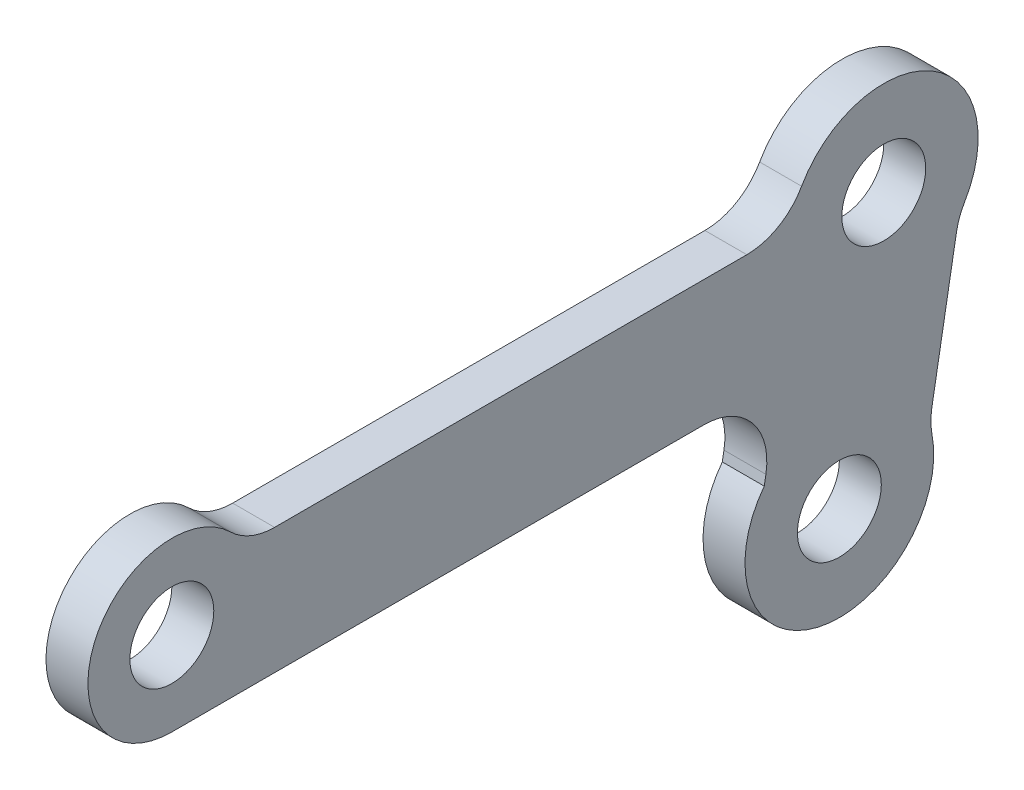
ISO-10303-21;
HEADER;
FILE_DESCRIPTION(('STEP AP214'),'2;1');
FILE_NAME('part.step','',(''),(''),'','','');
FILE_SCHEMA(('AUTOMOTIVE_DESIGN { 1 0 10303 214 1 1 1 1 }'));
ENDSEC;
DATA;
#1=APPLICATION_CONTEXT('core data for automotive mechanical design processes');
#2=APPLICATION_PROTOCOL_DEFINITION('international standard','automotive_design',2000,#1);
#3=PRODUCT_CONTEXT('',#1,'mechanical');
#4=PRODUCT('Part','Part','',(#3));
#5=PRODUCT_RELATED_PRODUCT_CATEGORY('part','',(#4));
#6=PRODUCT_DEFINITION_FORMATION('','',#4);
#7=PRODUCT_DEFINITION_CONTEXT('part definition',#1,'design');
#8=PRODUCT_DEFINITION('design','',#6,#7);
#9=PRODUCT_DEFINITION_SHAPE('','',#8);
#10=(LENGTH_UNIT() NAMED_UNIT(*) SI_UNIT(.MILLI.,.METRE.));
#11=(NAMED_UNIT(*) PLANE_ANGLE_UNIT() SI_UNIT($,.RADIAN.));
#12=(NAMED_UNIT(*) SI_UNIT($,.STERADIAN.) SOLID_ANGLE_UNIT());
#13=UNCERTAINTY_MEASURE_WITH_UNIT(LENGTH_MEASURE(1.E-05),#10,'distance_accuracy_value','');
#14=(GEOMETRIC_REPRESENTATION_CONTEXT(3) GLOBAL_UNCERTAINTY_ASSIGNED_CONTEXT((#13)) GLOBAL_UNIT_ASSIGNED_CONTEXT((#10,
#11,#12)) REPRESENTATION_CONTEXT('',''));
#15=CARTESIAN_POINT('',(0.,0.,0.));
#16=DIRECTION('',(0.,0.,1.));
#17=DIRECTION('',(1.,0.,0.));
#18=AXIS2_PLACEMENT_3D('',#15,#16,#17);
#19=CARTESIAN_POINT('',(0.,-2.,30.));
#20=DIRECTION('',(1.,0.,0.));
#21=DIRECTION('',(0.,0.,-1.));
#22=AXIS2_PLACEMENT_3D('',#19,#20,#21);
#23=PLANE('',#22);
#24=CARTESIAN_POINT('',(0.,-2.,30.));
#25=DIRECTION('',(1.,0.,0.));
#26=DIRECTION('',(0.,0.,-1.));
#27=AXIS2_PLACEMENT_3D('',#24,#25,#26);
#28=CIRCLE('',#27,2.);
#29=CARTESIAN_POINT('',(0.,-2.,28.));
#30=VERTEX_POINT('',#29);
#31=EDGE_CURVE('E438',#30,#30,#28,.T.);
#32=ORIENTED_EDGE('',*,*,#31,.T.);
#33=EDGE_LOOP('',(#32));
#34=FACE_BOUND('',#33,.T.);
#35=CARTESIAN_POINT('',(0.,-0.694592710667744,-3.93923101204885));
#36=DIRECTION('',(1.,0.,0.));
#37=DIRECTION('',(0.,0.,-1.));
#38=AXIS2_PLACEMENT_3D('',#35,#36,#37);
#39=CIRCLE('',#38,2.);
#40=CARTESIAN_POINT('',(0.,-0.694592710667744,-5.93923101204885));
#41=VERTEX_POINT('',#40);
#42=EDGE_CURVE('E434',#41,#41,#39,.T.);
#43=ORIENTED_EDGE('',*,*,#42,.T.);
#44=EDGE_LOOP('',(#43));
#45=FACE_BOUND('',#44,.T.);
#46=CARTESIAN_POINT('',(0.,-12.6945927106677,-1.82330724354715));
#47=DIRECTION('',(1.,0.,0.));
#48=DIRECTION('',(0.,0.,-1.));
#49=AXIS2_PLACEMENT_3D('',#46,#47,#48);
#50=CIRCLE('',#49,2.);
#51=CARTESIAN_POINT('',(0.,-12.6945927106677,-3.82330724354715));
#52=VERTEX_POINT('',#51);
#53=EDGE_CURVE('E426',#52,#52,#50,.T.);
#54=ORIENTED_EDGE('',*,*,#53,.T.);
#55=EDGE_LOOP('',(#54));
#56=FACE_BOUND('',#55,.T.);
#57=CARTESIAN_POINT('',(0.,-0.694592710667744,-3.93923101204885));
#58=DIRECTION('',(1.,0.,0.));
#59=DIRECTION('',(0.,0.,-1.));
#60=AXIS2_PLACEMENT_3D('',#57,#58,#59);
#61=CIRCLE('',#60,4.50000000000002);
#62=CARTESIAN_POINT('',(0.,-3.01492067286327,-7.79488635814162));
#63=VERTEX_POINT('',#62);
#64=CARTESIAN_POINT('',(0.,1.52216291573291,-0.0231111858916789));
#65=VERTEX_POINT('',#64);
#66=EDGE_CURVE('E246',#63,#65,#61,.T.);
#67=ORIENTED_EDGE('',*,*,#66,.F.);
#68=CARTESIAN_POINT('',(0.,-4.56180598099362,-10.3653232555368));
#69=DIRECTION('',(1.,0.,0.));
#70=DIRECTION('',(0.,0.,-1.));
#71=AXIS2_PLACEMENT_3D('',#68,#69,#70);
#72=CIRCLE('',#71,3.);
#73=CARTESIAN_POINT('',(0.,-4.0408614479928,-7.41089999650016));
#74=VERTEX_POINT('',#73);
#75=EDGE_CURVE('E319',#63,#74,#72,.T.);
#76=ORIENTED_EDGE('',*,*,#75,.T.);
#77=DIRECTION('',(0.,-0.984807753012206,0.173648177666942));
#78=VECTOR('',#77,1.);
#79=CARTESIAN_POINT('',(0.,-1.38918542133549,-7.8784620240977));
#80=LINE('',#79,#78);
#81=CARTESIAN_POINT('',(0.,-10.7375093946782,-6.23010028319352));
#82=VERTEX_POINT('',#81);
#83=EDGE_CURVE('E259',#74,#82,#80,.T.);
#84=ORIENTED_EDGE('',*,*,#83,.T.);
#85=CARTESIAN_POINT('',(0.,-11.258453927679,-9.18452354223013));
#86=DIRECTION('',(1.,0.,0.));
#87=DIRECTION('',(0.,0.,-1.));
#88=AXIS2_PLACEMENT_3D('',#85,#86,#87);
#89=CIRCLE('',#88,3.);
#90=CARTESIAN_POINT('',(0.,-11.8329094408745,-6.24003702275695));
#91=VERTEX_POINT('',#90);
#92=EDGE_CURVE('E313',#82,#91,#89,.T.);
#93=ORIENTED_EDGE('',*,*,#92,.T.);
#94=CARTESIAN_POINT('',(0.,-12.6945927106677,-1.82330724354715));
#95=DIRECTION('',(1.,0.,0.));
#96=DIRECTION('',(0.,0.,-1.));
#97=AXIS2_PLACEMENT_3D('',#94,#95,#96);
#98=CIRCLE('',#97,4.50000000000002);
#99=CARTESIAN_POINT('',(0.,-9.96976680670167,1.75793887939326));
#100=VERTEX_POINT('',#99);
#101=EDGE_CURVE('E273',#100,#91,#98,.T.);
#102=ORIENTED_EDGE('',*,*,#101,.F.);
#103=DIRECTION('',(0.,-0.984807753012207,0.173648177666938));
#104=VECTOR('',#103,1.);
#105=CARTESIAN_POINT('',(0.,0.,0.));
#106=LINE('',#105,#104);
#107=CARTESIAN_POINT('',(0.,-9.52094453300082,1.67879940299688));
#108=VERTEX_POINT('',#107);
#109=EDGE_CURVE('E263',#108,#100,#106,.T.);
#110=ORIENTED_EDGE('',*,*,#109,.F.);
#111=CARTESIAN_POINT('',(0.,-9.00000000000001,4.6332226620335));
#112=DIRECTION('',(1.,0.,0.));
#113=DIRECTION('',(0.,0.,-1.));
#114=AXIS2_PLACEMENT_3D('',#111,#112,#113);
#115=CIRCLE('',#114,3.);
#116=CARTESIAN_POINT('',(0.,-6.,4.6332226620335));
#117=VERTEX_POINT('',#116);
#118=EDGE_CURVE('E236',#108,#117,#115,.T.);
#119=ORIENTED_EDGE('',*,*,#118,.T.);
#120=DIRECTION('',(0.,0.,-1.));
#121=VECTOR('',#120,1.);
#122=CARTESIAN_POINT('',(0.,-6.,30.));
#123=LINE('',#122,#121);
#124=CARTESIAN_POINT('',(0.,-5.99999999999999,30.));
#125=VERTEX_POINT('',#124);
#126=EDGE_CURVE('E227',#125,#117,#123,.T.);
#127=ORIENTED_EDGE('',*,*,#126,.F.);
#128=CARTESIAN_POINT('',(0.,-2.,30.));
#129=DIRECTION('',(1.,0.,0.));
#130=DIRECTION('',(0.,0.,-1.));
#131=AXIS2_PLACEMENT_3D('',#128,#129,#130);
#132=CIRCLE('',#131,3.99999999999999);
#133=CARTESIAN_POINT('',(0.,0.857142857142855,27.2005831511049));
#134=VERTEX_POINT('',#133);
#135=EDGE_CURVE('E212',#134,#125,#132,.T.);
#136=ORIENTED_EDGE('',*,*,#135,.F.);
#137=CARTESIAN_POINT('',(0.,3.,25.1010205144337));
#138=DIRECTION('',(1.,0.,0.));
#139=DIRECTION('',(0.,0.,-1.));
#140=AXIS2_PLACEMENT_3D('',#137,#138,#139);
#141=CIRCLE('',#140,3.);
#142=CARTESIAN_POINT('',(0.,0.,25.1010205144337));
#143=VERTEX_POINT('',#142);
#144=EDGE_CURVE('E132',#134,#143,#141,.T.);
#145=ORIENTED_EDGE('',*,*,#144,.T.);
#146=DIRECTION('',(0.,0.,-1.));
#147=VECTOR('',#146,1.);
#148=CARTESIAN_POINT('',(0.,0.,30.));
#149=LINE('',#148,#147);
#150=CARTESIAN_POINT('',(0.,0.,2.58763536487976));
#151=VERTEX_POINT('',#150);
#152=EDGE_CURVE('E238',#143,#151,#149,.T.);
#153=ORIENTED_EDGE('',*,*,#152,.T.);
#154=CARTESIAN_POINT('',(0.,3.,2.58763536487975));
#155=DIRECTION('',(1.,0.,0.));
#156=DIRECTION('',(0.,0.,-1.));
#157=AXIS2_PLACEMENT_3D('',#154,#155,#156);
#158=CIRCLE('',#157,3.);
#159=EDGE_CURVE('E330',#151,#65,#158,.T.);
#160=ORIENTED_EDGE('',*,*,#159,.T.);
#161=EDGE_LOOP('',(#67,#76,#84,#93,#102,#110,#119,#127,#136,#145,#153,#160));
#162=FACE_BOUND('',#161,.T.);
#163=ADVANCED_FACE('F123',(#34,#45,#56,#162),#23,.F.);
#164=CARTESIAN_POINT('',(2.,-2.,30.));
#165=DIRECTION('',(1.,0.,0.));
#166=DIRECTION('',(0.,0.,-1.));
#167=AXIS2_PLACEMENT_3D('',#164,#165,#166);
#168=PLANE('',#167);
#169=CARTESIAN_POINT('',(2.,-2.,30.));
#170=DIRECTION('',(1.,0.,0.));
#171=DIRECTION('',(0.,0.,-1.));
#172=AXIS2_PLACEMENT_3D('',#169,#170,#171);
#173=CIRCLE('',#172,2.);
#174=CARTESIAN_POINT('',(2.,-2.,28.));
#175=VERTEX_POINT('',#174);
#176=EDGE_CURVE('E277',#175,#175,#173,.T.);
#177=ORIENTED_EDGE('',*,*,#176,.F.);
#178=EDGE_LOOP('',(#177));
#179=FACE_BOUND('',#178,.T.);
#180=CARTESIAN_POINT('',(2.,-0.694592710667744,-3.93923101204885));
#181=DIRECTION('',(1.,0.,0.));
#182=DIRECTION('',(0.,0.,-1.));
#183=AXIS2_PLACEMENT_3D('',#180,#181,#182);
#184=CIRCLE('',#183,2.);
#185=CARTESIAN_POINT('',(2.,-0.694592710667744,-5.93923101204885));
#186=VERTEX_POINT('',#185);
#187=EDGE_CURVE('E430',#186,#186,#184,.T.);
#188=ORIENTED_EDGE('',*,*,#187,.F.);
#189=EDGE_LOOP('',(#188));
#190=FACE_BOUND('',#189,.T.);
#191=CARTESIAN_POINT('',(2.,-12.6945927106677,-1.82330724354715));
#192=DIRECTION('',(1.,0.,0.));
#193=DIRECTION('',(0.,0.,-1.));
#194=AXIS2_PLACEMENT_3D('',#191,#192,#193);
#195=CIRCLE('',#194,2.);
#196=CARTESIAN_POINT('',(2.,-12.6945927106677,-3.82330724354715));
#197=VERTEX_POINT('',#196);
#198=EDGE_CURVE('E422',#197,#197,#195,.T.);
#199=ORIENTED_EDGE('',*,*,#198,.F.);
#200=EDGE_LOOP('',(#199));
#201=FACE_BOUND('',#200,.T.);
#202=DIRECTION('',(0.,-0.984807753012206,0.173648177666942));
#203=VECTOR('',#202,1.);
#204=CARTESIAN_POINT('',(2.,-1.38918542133549,-7.8784620240977));
#205=LINE('',#204,#203);
#206=CARTESIAN_POINT('',(2.,-4.0408614479928,-7.41089999650016));
#207=VERTEX_POINT('',#206);
#208=CARTESIAN_POINT('',(2.,-10.7375093946782,-6.23010028319352));
#209=VERTEX_POINT('',#208);
#210=EDGE_CURVE('E258',#207,#209,#205,.T.);
#211=ORIENTED_EDGE('',*,*,#210,.F.);
#212=CARTESIAN_POINT('',(2.,-4.56180598099362,-10.3653232555368));
#213=DIRECTION('',(1.,0.,0.));
#214=DIRECTION('',(0.,0.,-1.));
#215=AXIS2_PLACEMENT_3D('',#212,#213,#214);
#216=CIRCLE('',#215,3.);
#217=CARTESIAN_POINT('',(2.,-3.01492067286327,-7.79488635814162));
#218=VERTEX_POINT('',#217);
#219=EDGE_CURVE('E322',#207,#218,#216,.F.);
#220=ORIENTED_EDGE('',*,*,#219,.T.);
#221=CARTESIAN_POINT('',(2.,-0.694592710667744,-3.93923101204885));
#222=DIRECTION('',(1.,0.,0.));
#223=DIRECTION('',(0.,0.,-1.));
#224=AXIS2_PLACEMENT_3D('',#221,#222,#223);
#225=CIRCLE('',#224,4.50000000000002);
#226=CARTESIAN_POINT('',(2.,1.52216291573291,-0.0231111858916789));
#227=VERTEX_POINT('',#226);
#228=EDGE_CURVE('E239',#218,#227,#225,.T.);
#229=ORIENTED_EDGE('',*,*,#228,.T.);
#230=CARTESIAN_POINT('',(2.,3.,2.58763536487975));
#231=DIRECTION('',(1.,0.,0.));
#232=DIRECTION('',(0.,0.,-1.));
#233=AXIS2_PLACEMENT_3D('',#230,#231,#232);
#234=CIRCLE('',#233,3.);
#235=CARTESIAN_POINT('',(2.,0.,2.58763536487976));
#236=VERTEX_POINT('',#235);
#237=EDGE_CURVE('E333',#227,#236,#234,.F.);
#238=ORIENTED_EDGE('',*,*,#237,.T.);
#239=DIRECTION('',(0.,0.,-1.));
#240=VECTOR('',#239,1.);
#241=CARTESIAN_POINT('',(2.,0.,30.));
#242=LINE('',#241,#240);
#243=CARTESIAN_POINT('',(2.,0.,25.1010205144337));
#244=VERTEX_POINT('',#243);
#245=EDGE_CURVE('E222',#244,#236,#242,.T.);
#246=ORIENTED_EDGE('',*,*,#245,.F.);
#247=CARTESIAN_POINT('',(2.,3.,25.1010205144337));
#248=DIRECTION('',(1.,0.,0.));
#249=DIRECTION('',(0.,0.,-1.));
#250=AXIS2_PLACEMENT_3D('',#247,#248,#249);
#251=CIRCLE('',#250,3.);
#252=CARTESIAN_POINT('',(2.,0.857142857142855,27.2005831511049));
#253=VERTEX_POINT('',#252);
#254=EDGE_CURVE('E12',#244,#253,#251,.F.);
#255=ORIENTED_EDGE('',*,*,#254,.T.);
#256=CARTESIAN_POINT('',(2.,-2.,30.));
#257=DIRECTION('',(1.,0.,0.));
#258=DIRECTION('',(0.,0.,-1.));
#259=AXIS2_PLACEMENT_3D('',#256,#257,#258);
#260=CIRCLE('',#259,3.99999999999999);
#261=CARTESIAN_POINT('',(2.,-6.,30.));
#262=VERTEX_POINT('',#261);
#263=EDGE_CURVE('E221',#253,#262,#260,.T.);
#264=ORIENTED_EDGE('',*,*,#263,.T.);
#265=DIRECTION('',(0.,0.,-1.));
#266=VECTOR('',#265,1.);
#267=CARTESIAN_POINT('',(2.,-6.,30.));
#268=LINE('',#267,#266);
#269=CARTESIAN_POINT('',(2.,-6.,4.6332226620335));
#270=VERTEX_POINT('',#269);
#271=EDGE_CURVE('E230',#262,#270,#268,.T.);
#272=ORIENTED_EDGE('',*,*,#271,.T.);
#273=CARTESIAN_POINT('',(2.,-9.00000000000001,4.6332226620335));
#274=DIRECTION('',(1.,0.,0.));
#275=DIRECTION('',(0.,0.,-1.));
#276=AXIS2_PLACEMENT_3D('',#273,#274,#275);
#277=CIRCLE('',#276,3.);
#278=CARTESIAN_POINT('',(2.,-9.52094453300082,1.67879940299688));
#279=VERTEX_POINT('',#278);
#280=EDGE_CURVE('E327',#270,#279,#277,.F.);
#281=ORIENTED_EDGE('',*,*,#280,.T.);
#282=DIRECTION('',(0.,-0.984807753012207,0.173648177666938));
#283=VECTOR('',#282,1.);
#284=CARTESIAN_POINT('',(2.,0.,0.));
#285=LINE('',#284,#283);
#286=CARTESIAN_POINT('',(2.,-9.96976680670167,1.75793887939326));
#287=VERTEX_POINT('',#286);
#288=EDGE_CURVE('E255',#279,#287,#285,.T.);
#289=ORIENTED_EDGE('',*,*,#288,.T.);
#290=CARTESIAN_POINT('',(2.,-12.6945927106677,-1.82330724354715));
#291=DIRECTION('',(1.,0.,0.));
#292=DIRECTION('',(0.,0.,-1.));
#293=AXIS2_PLACEMENT_3D('',#290,#291,#292);
#294=CIRCLE('',#293,4.50000000000002);
#295=CARTESIAN_POINT('',(2.,-11.8329094408745,-6.24003702275695));
#296=VERTEX_POINT('',#295);
#297=EDGE_CURVE('E266',#287,#296,#294,.T.);
#298=ORIENTED_EDGE('',*,*,#297,.T.);
#299=CARTESIAN_POINT('',(2.,-11.258453927679,-9.18452354223013));
#300=DIRECTION('',(1.,0.,0.));
#301=DIRECTION('',(0.,0.,-1.));
#302=AXIS2_PLACEMENT_3D('',#299,#300,#301);
#303=CIRCLE('',#302,3.);
#304=EDGE_CURVE('E316',#296,#209,#303,.F.);
#305=ORIENTED_EDGE('',*,*,#304,.T.);
#306=EDGE_LOOP('',(#211,#220,#229,#238,#246,#255,#264,#272,#281,#289,#298,#305));
#307=FACE_BOUND('',#306,.T.);
#308=ADVANCED_FACE('F350',(#179,#190,#201,#307),#168,.T.);
#309=CARTESIAN_POINT('',(2.,-2.,30.));
#310=DIRECTION('',(-1.,0.,0.));
#311=DIRECTION('',(0.,0.,1.));
#312=AXIS2_PLACEMENT_3D('',#309,#310,#311);
#313=CYLINDRICAL_SURFACE('',#312,3.99999999999999);
#314=ORIENTED_EDGE('',*,*,#263,.F.);
#315=DIRECTION('',(-1.,0.,0.));
#316=VECTOR('',#315,1.);
#317=CARTESIAN_POINT('',(2.,0.857142857142856,27.2005831511049));
#318=LINE('',#317,#316);
#319=EDGE_CURVE('E217',#253,#134,#318,.T.);
#320=ORIENTED_EDGE('',*,*,#319,.T.);
#321=ORIENTED_EDGE('',*,*,#135,.T.);
#322=DIRECTION('',(-1.,0.,0.));
#323=VECTOR('',#322,1.);
#324=CARTESIAN_POINT('',(2.,-6.,30.));
#325=LINE('',#324,#323);
#326=EDGE_CURVE('E215',#262,#125,#325,.T.);
#327=ORIENTED_EDGE('',*,*,#326,.F.);
#328=EDGE_LOOP('',(#314,#320,#321,#327));
#329=FACE_BOUND('',#328,.T.);
#330=ADVANCED_FACE('F214',(#329),#313,.T.);
#331=CARTESIAN_POINT('',(2.,-12.6945927106677,-1.82330724354715));
#332=DIRECTION('',(-1.,0.,0.));
#333=DIRECTION('',(0.,0.,1.));
#334=AXIS2_PLACEMENT_3D('',#331,#332,#333);
#335=CYLINDRICAL_SURFACE('',#334,4.50000000000002);
#336=ORIENTED_EDGE('',*,*,#101,.T.);
#337=DIRECTION('',(-1.,0.,0.));
#338=VECTOR('',#337,1.);
#339=CARTESIAN_POINT('',(2.,-11.8329094408745,-6.24003702275695));
#340=LINE('',#339,#338);
#341=EDGE_CURVE('E287',#91,#296,#340,.F.);
#342=ORIENTED_EDGE('',*,*,#341,.T.);
#343=ORIENTED_EDGE('',*,*,#297,.F.);
#344=DIRECTION('',(-1.,0.,0.));
#345=VECTOR('',#344,1.);
#346=CARTESIAN_POINT('',(2.,-9.96976680670167,1.75793887939326));
#347=LINE('',#346,#345);
#348=EDGE_CURVE('E254',#287,#100,#347,.T.);
#349=ORIENTED_EDGE('',*,*,#348,.T.);
#350=EDGE_LOOP('',(#336,#342,#343,#349));
#351=FACE_BOUND('',#350,.T.);
#352=ADVANCED_FACE('F349',(#351),#335,.T.);
#353=CARTESIAN_POINT('',(2.,-1.38918542133549,-7.8784620240977));
#354=DIRECTION('',(0.,-0.173648177666942,-0.984807753012206));
#355=DIRECTION('',(0.,0.984807753012206,-0.173648177666942));
#356=AXIS2_PLACEMENT_3D('',#353,#354,#355);
#357=PLANE('',#356);
#358=ORIENTED_EDGE('',*,*,#210,.T.);
#359=DIRECTION('',(-1.,0.,0.));
#360=VECTOR('',#359,1.);
#361=CARTESIAN_POINT('',(2.,-10.7375093946782,-6.23010028319352));
#362=LINE('',#361,#360);
#363=EDGE_CURVE('E283',#209,#82,#362,.T.);
#364=ORIENTED_EDGE('',*,*,#363,.T.);
#365=ORIENTED_EDGE('',*,*,#83,.F.);
#366=DIRECTION('',(-1.,0.,0.));
#367=VECTOR('',#366,1.);
#368=CARTESIAN_POINT('',(2.,-4.0408614479928,-7.41089999650016));
#369=LINE('',#368,#367);
#370=EDGE_CURVE('E232',#74,#207,#369,.F.);
#371=ORIENTED_EDGE('',*,*,#370,.T.);
#372=EDGE_LOOP('',(#358,#364,#365,#371));
#373=FACE_BOUND('',#372,.T.);
#374=ADVANCED_FACE('F356',(#373),#357,.T.);
#375=CARTESIAN_POINT('',(2.,0.,0.));
#376=DIRECTION('',(0.,-0.173648177666938,-0.984807753012207));
#377=DIRECTION('',(0.,0.984807753012207,-0.173648177666938));
#378=AXIS2_PLACEMENT_3D('',#375,#376,#377);
#379=PLANE('',#378);
#380=ORIENTED_EDGE('',*,*,#288,.F.);
#381=DIRECTION('',(-1.,0.,0.));
#382=VECTOR('',#381,1.);
#383=CARTESIAN_POINT('',(0.,-9.52094453300082,1.67879940299688));
#384=LINE('',#383,#382);
#385=EDGE_CURVE('E297',#279,#108,#384,.T.);
#386=ORIENTED_EDGE('',*,*,#385,.T.);
#387=ORIENTED_EDGE('',*,*,#109,.T.);
#388=ORIENTED_EDGE('',*,*,#348,.F.);
#389=EDGE_LOOP('',(#380,#386,#387,#388));
#390=FACE_BOUND('',#389,.T.);
#391=ADVANCED_FACE('F359',(#390),#379,.F.);
#392=CARTESIAN_POINT('',(2.,-0.694592710667744,-3.93923101204885));
#393=DIRECTION('',(-1.,0.,0.));
#394=DIRECTION('',(0.,0.,1.));
#395=AXIS2_PLACEMENT_3D('',#392,#393,#394);
#396=CYLINDRICAL_SURFACE('',#395,4.50000000000002);
#397=ORIENTED_EDGE('',*,*,#228,.F.);
#398=DIRECTION('',(-1.,0.,0.));
#399=VECTOR('',#398,1.);
#400=CARTESIAN_POINT('',(2.,-3.01492067286327,-7.79488635814162));
#401=LINE('',#400,#399);
#402=EDGE_CURVE('E293',#218,#63,#401,.T.);
#403=ORIENTED_EDGE('',*,*,#402,.T.);
#404=ORIENTED_EDGE('',*,*,#66,.T.);
#405=DIRECTION('',(-1.,0.,0.));
#406=VECTOR('',#405,1.);
#407=CARTESIAN_POINT('',(2.,1.52216291573291,-0.0231111858916789));
#408=LINE('',#407,#406);
#409=EDGE_CURVE('E290',#65,#227,#408,.F.);
#410=ORIENTED_EDGE('',*,*,#409,.T.);
#411=EDGE_LOOP('',(#397,#403,#404,#410));
#412=FACE_BOUND('',#411,.T.);
#413=ADVANCED_FACE('F363',(#412),#396,.T.);
#414=CARTESIAN_POINT('',(2.,0.,30.));
#415=DIRECTION('',(0.,1.,0.));
#416=DIRECTION('',(0.,0.,1.));
#417=AXIS2_PLACEMENT_3D('',#414,#415,#416);
#418=PLANE('',#417);
#419=ORIENTED_EDGE('',*,*,#245,.T.);
#420=DIRECTION('',(-1.,0.,0.));
#421=VECTOR('',#420,1.);
#422=CARTESIAN_POINT('',(2.,0.,2.58763536487976));
#423=LINE('',#422,#421);
#424=EDGE_CURVE('E307',#236,#151,#423,.T.);
#425=ORIENTED_EDGE('',*,*,#424,.T.);
#426=ORIENTED_EDGE('',*,*,#152,.F.);
#427=DIRECTION('',(-1.,0.,0.));
#428=VECTOR('',#427,1.);
#429=CARTESIAN_POINT('',(2.,0.,25.1010205144337));
#430=LINE('',#429,#428);
#431=EDGE_CURVE('E304',#143,#244,#430,.F.);
#432=ORIENTED_EDGE('',*,*,#431,.T.);
#433=EDGE_LOOP('',(#419,#425,#426,#432));
#434=FACE_BOUND('',#433,.T.);
#435=ADVANCED_FACE('F339',(#434),#418,.T.);
#436=CARTESIAN_POINT('',(2.,-6.,30.));
#437=DIRECTION('',(0.,1.,0.));
#438=DIRECTION('',(0.,0.,1.));
#439=AXIS2_PLACEMENT_3D('',#436,#437,#438);
#440=PLANE('',#439);
#441=ORIENTED_EDGE('',*,*,#126,.T.);
#442=DIRECTION('',(-1.,0.,0.));
#443=VECTOR('',#442,1.);
#444=CARTESIAN_POINT('',(2.,-6.,4.6332226620335));
#445=LINE('',#444,#443);
#446=EDGE_CURVE('E301',#117,#270,#445,.F.);
#447=ORIENTED_EDGE('',*,*,#446,.T.);
#448=ORIENTED_EDGE('',*,*,#271,.F.);
#449=ORIENTED_EDGE('',*,*,#326,.T.);
#450=EDGE_LOOP('',(#441,#447,#448,#449));
#451=FACE_BOUND('',#450,.T.);
#452=ADVANCED_FACE('F226',(#451),#440,.F.);
#453=CARTESIAN_POINT('',(2.,-12.6945927106677,-1.82330724354715));
#454=DIRECTION('',(-1.,0.,0.));
#455=DIRECTION('',(0.,0.,1.));
#456=AXIS2_PLACEMENT_3D('',#453,#454,#455);
#457=CYLINDRICAL_SURFACE('',#456,2.);
#458=ORIENTED_EDGE('',*,*,#198,.T.);
#459=EDGE_LOOP('',(#458));
#460=FACE_BOUND('',#459,.T.);
#461=ORIENTED_EDGE('',*,*,#53,.F.);
#462=EDGE_LOOP('',(#461));
#463=FACE_BOUND('',#462,.T.);
#464=ADVANCED_FACE('F362',(#460,#463),#457,.F.);
#465=CARTESIAN_POINT('',(2.,-0.694592710667744,-3.93923101204885));
#466=DIRECTION('',(-1.,0.,0.));
#467=DIRECTION('',(0.,0.,1.));
#468=AXIS2_PLACEMENT_3D('',#465,#466,#467);
#469=CYLINDRICAL_SURFACE('',#468,2.);
#470=ORIENTED_EDGE('',*,*,#187,.T.);
#471=EDGE_LOOP('',(#470));
#472=FACE_BOUND('',#471,.T.);
#473=ORIENTED_EDGE('',*,*,#42,.F.);
#474=EDGE_LOOP('',(#473));
#475=FACE_BOUND('',#474,.T.);
#476=ADVANCED_FACE('F453',(#472,#475),#469,.F.);
#477=CARTESIAN_POINT('',(2.,-2.,30.));
#478=DIRECTION('',(-1.,0.,0.));
#479=DIRECTION('',(0.,0.,1.));
#480=AXIS2_PLACEMENT_3D('',#477,#478,#479);
#481=CYLINDRICAL_SURFACE('',#480,2.);
#482=ORIENTED_EDGE('',*,*,#176,.T.);
#483=EDGE_LOOP('',(#482));
#484=FACE_BOUND('',#483,.T.);
#485=ORIENTED_EDGE('',*,*,#31,.F.);
#486=EDGE_LOOP('',(#485));
#487=FACE_BOUND('',#486,.T.);
#488=ADVANCED_FACE('F391',(#484,#487),#481,.F.);
#489=CARTESIAN_POINT('',(2.,-11.258453927679,-9.18452354223013));
#490=DIRECTION('',(-1.,0.,0.));
#491=DIRECTION('',(0.,0.,1.));
#492=AXIS2_PLACEMENT_3D('',#489,#490,#491);
#493=CYLINDRICAL_SURFACE('',#492,3.);
#494=ORIENTED_EDGE('',*,*,#304,.F.);
#495=ORIENTED_EDGE('',*,*,#341,.F.);
#496=ORIENTED_EDGE('',*,*,#92,.F.);
#497=ORIENTED_EDGE('',*,*,#363,.F.);
#498=EDGE_LOOP('',(#494,#495,#496,#497));
#499=FACE_BOUND('',#498,.T.);
#500=ADVANCED_FACE('F387',(#499),#493,.F.);
#501=CARTESIAN_POINT('',(2.,-4.56180598099362,-10.3653232555368));
#502=DIRECTION('',(-1.,0.,0.));
#503=DIRECTION('',(0.,0.,1.));
#504=AXIS2_PLACEMENT_3D('',#501,#502,#503);
#505=CYLINDRICAL_SURFACE('',#504,3.);
#506=ORIENTED_EDGE('',*,*,#219,.F.);
#507=ORIENTED_EDGE('',*,*,#370,.F.);
#508=ORIENTED_EDGE('',*,*,#75,.F.);
#509=ORIENTED_EDGE('',*,*,#402,.F.);
#510=EDGE_LOOP('',(#506,#507,#508,#509));
#511=FACE_BOUND('',#510,.T.);
#512=ADVANCED_FACE('F390',(#511),#505,.F.);
#513=CARTESIAN_POINT('',(2.,-9.00000000000001,4.6332226620335));
#514=DIRECTION('',(1.,0.,0.));
#515=DIRECTION('',(0.,0.,-1.));
#516=AXIS2_PLACEMENT_3D('',#513,#514,#515);
#517=CYLINDRICAL_SURFACE('',#516,3.);
#518=ORIENTED_EDGE('',*,*,#280,.F.);
#519=ORIENTED_EDGE('',*,*,#446,.F.);
#520=ORIENTED_EDGE('',*,*,#118,.F.);
#521=ORIENTED_EDGE('',*,*,#385,.F.);
#522=EDGE_LOOP('',(#518,#519,#520,#521));
#523=FACE_BOUND('',#522,.T.);
#524=ADVANCED_FACE('F346',(#523),#517,.F.);
#525=CARTESIAN_POINT('',(2.,3.,2.58763536487975));
#526=DIRECTION('',(-1.,0.,0.));
#527=DIRECTION('',(0.,0.,1.));
#528=AXIS2_PLACEMENT_3D('',#525,#526,#527);
#529=CYLINDRICAL_SURFACE('',#528,3.);
#530=ORIENTED_EDGE('',*,*,#237,.F.);
#531=ORIENTED_EDGE('',*,*,#409,.F.);
#532=ORIENTED_EDGE('',*,*,#159,.F.);
#533=ORIENTED_EDGE('',*,*,#424,.F.);
#534=EDGE_LOOP('',(#530,#531,#532,#533));
#535=FACE_BOUND('',#534,.T.);
#536=ADVANCED_FACE('F342',(#535),#529,.F.);
#537=CARTESIAN_POINT('',(2.,3.,25.1010205144337));
#538=DIRECTION('',(-1.,0.,0.));
#539=DIRECTION('',(0.,0.,1.));
#540=AXIS2_PLACEMENT_3D('',#537,#538,#539);
#541=CYLINDRICAL_SURFACE('',#540,3.);
#542=ORIENTED_EDGE('',*,*,#254,.F.);
#543=ORIENTED_EDGE('',*,*,#431,.F.);
#544=ORIENTED_EDGE('',*,*,#144,.F.);
#545=ORIENTED_EDGE('',*,*,#319,.F.);
#546=EDGE_LOOP('',(#542,#543,#544,#545));
#547=FACE_BOUND('',#546,.T.);
#548=ADVANCED_FACE('F125',(#547),#541,.F.);
#549=CLOSED_SHELL('',(#163,#308,#330,#352,#374,#391,#413,#435,#452,#464,#476,#488,#500,#512,
#524,#536,#548));
#550=MANIFOLD_SOLID_BREP('B2',#549);
#551=ADVANCED_BREP_SHAPE_REPRESENTATION('',(#18,#550),#14);
#552=SHAPE_DEFINITION_REPRESENTATION(#9,#551);
ENDSEC;
END-ISO-10303-21;
